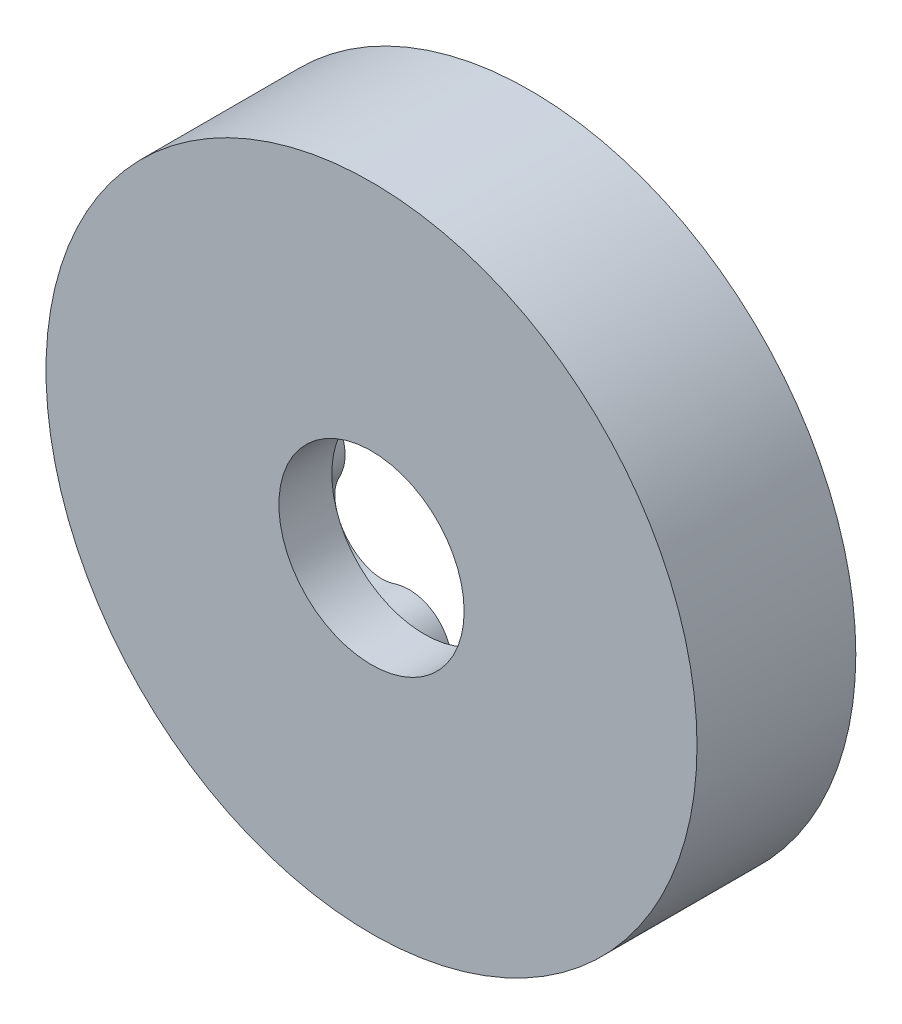
ISO-10303-21;
HEADER;
FILE_DESCRIPTION(('STEP AP214'),'2;1');
FILE_NAME('part.step','',(''),(''),'','','');
FILE_SCHEMA(('AUTOMOTIVE_DESIGN { 1 0 10303 214 1 1 1 1 }'));
ENDSEC;
DATA;
#1=APPLICATION_CONTEXT('core data for automotive mechanical design processes');
#2=APPLICATION_PROTOCOL_DEFINITION('international standard','automotive_design',2000,#1);
#3=PRODUCT_CONTEXT('',#1,'mechanical');
#4=PRODUCT('Part','Part','',(#3));
#5=PRODUCT_RELATED_PRODUCT_CATEGORY('part','',(#4));
#6=PRODUCT_DEFINITION_FORMATION('','',#4);
#7=PRODUCT_DEFINITION_CONTEXT('part definition',#1,'design');
#8=PRODUCT_DEFINITION('design','',#6,#7);
#9=PRODUCT_DEFINITION_SHAPE('','',#8);
#10=(LENGTH_UNIT() NAMED_UNIT(*) SI_UNIT(.MILLI.,.METRE.));
#11=(NAMED_UNIT(*) PLANE_ANGLE_UNIT() SI_UNIT($,.RADIAN.));
#12=(NAMED_UNIT(*) SI_UNIT($,.STERADIAN.) SOLID_ANGLE_UNIT());
#13=UNCERTAINTY_MEASURE_WITH_UNIT(LENGTH_MEASURE(1.E-05),#10,'distance_accuracy_value','');
#14=(GEOMETRIC_REPRESENTATION_CONTEXT(3) GLOBAL_UNCERTAINTY_ASSIGNED_CONTEXT((#13)) GLOBAL_UNIT_ASSIGNED_CONTEXT((#10,
#11,#12)) REPRESENTATION_CONTEXT('',''));
#15=CARTESIAN_POINT('',(0.,0.,0.));
#16=DIRECTION('',(0.,0.,1.));
#17=DIRECTION('',(1.,0.,0.));
#18=AXIS2_PLACEMENT_3D('',#15,#16,#17);
#19=CARTESIAN_POINT('',(0.,0.,0.));
#20=DIRECTION('',(0.,0.,1.));
#21=DIRECTION('',(1.,0.,0.));
#22=AXIS2_PLACEMENT_3D('',#19,#20,#21);
#23=PLANE('',#22);
#24=CARTESIAN_POINT('',(0.,0.,0.));
#25=DIRECTION('',(0.,0.,1.));
#26=DIRECTION('',(1.,0.,0.));
#27=AXIS2_PLACEMENT_3D('',#24,#25,#26);
#28=CIRCLE('',#27,12.3);
#29=CARTESIAN_POINT('',(12.3,0.,0.));
#30=VERTEX_POINT('',#29);
#31=EDGE_CURVE('E11',#30,#30,#28,.T.);
#32=ORIENTED_EDGE('',*,*,#31,.F.);
#33=EDGE_LOOP('',(#32));
#34=FACE_BOUND('',#33,.T.);
#35=CARTESIAN_POINT('',(7.55,0.,0.));
#36=CARTESIAN_POINT('',(7.55000000000027,0.022217466458351,0.));
#37=CARTESIAN_POINT('',(7.55109737708752,0.0666034399524704,0.));
#38=CARTESIAN_POINT('',(7.55603575821352,0.154882157827372,0.));
#39=CARTESIAN_POINT('',(7.56916783899283,0.254768484743971,0.));
#40=CARTESIAN_POINT('',(7.5927854806825,0.374358830288833,0.));
#41=CARTESIAN_POINT('',(7.63179107421422,0.51344008940082,0.));
#42=CARTESIAN_POINT('',(7.69959982716544,0.68617471523545,0.));
#43=CARTESIAN_POINT('',(7.80974701267501,0.886363911281186,0.));
#44=CARTESIAN_POINT('',(7.93834343482286,1.0561194537287,0.));
#45=CARTESIAN_POINT('',(8.0743672383786,1.19947756069296,0.));
#46=CARTESIAN_POINT('',(8.21390626106425,1.33110870091685,0.));
#47=CARTESIAN_POINT('',(8.36346331358419,1.4895036418915,0.));
#48=CARTESIAN_POINT('',(8.52117396998865,1.76029674905826,0.));
#49=CARTESIAN_POINT('',(8.62280091236655,2.12120006036529,0.));
#50=CARTESIAN_POINT('',(8.63998002290779,2.52542727921024,0.));
#51=CARTESIAN_POINT('',(8.57256056481981,2.92522878253747,0.));
#52=CARTESIAN_POINT('',(8.44322684602201,3.27872194255863,0.));
#53=CARTESIAN_POINT('',(8.23679143101039,3.62630702820879,0.));
#54=CARTESIAN_POINT('',(7.95931515564681,3.92599456017719,0.));
#55=CARTESIAN_POINT('',(7.64414612926547,4.13703738101209,0.));
#56=CARTESIAN_POINT('',(7.34433080737036,4.24098140231914,0.));
#57=CARTESIAN_POINT('',(7.11847736507926,4.26175080299851,0.));
#58=CARTESIAN_POINT('',(6.92340982369371,4.27404257216713,0.));
#59=CARTESIAN_POINT('',(6.72949429617699,4.29943333370208,0.));
#60=CARTESIAN_POINT('',(6.4790393779537,4.36132384923424,0.));
#61=CARTESIAN_POINT('',(6.18558438422689,4.49278647484299,0.));
#62=CARTESIAN_POINT('',(5.90099531096105,4.70134332074444,0.));
#63=CARTESIAN_POINT('',(5.65461647568606,4.99496626596589,0.));
#64=CARTESIAN_POINT('',(5.49864635662569,5.31144723524449,0.));
#65=CARTESIAN_POINT('',(5.4201390013435,5.62327233002649,0.));
#66=CARTESIAN_POINT('',(5.40267956639356,5.88066929892235,0.));
#67=CARTESIAN_POINT('',(5.41134800574686,6.07604813655972,0.));
#68=CARTESIAN_POINT('',(5.43311542020648,6.27028613950339,0.));
#69=CARTESIAN_POINT('',(5.45188177508213,6.49631574319122,0.));
#70=CARTESIAN_POINT('',(5.40157719258208,6.8096244453148,0.));
#71=CARTESIAN_POINT('',(5.24847253343536,7.1566549230986,0.));
#72=CARTESIAN_POINT('',(5.0015157096661,7.48195203824925,0.));
#73=CARTESIAN_POINT('',(4.69315520863561,7.74725973604298,0.));
#74=CARTESIAN_POINT('',(4.36274613674722,7.93802150241623,0.));
#75=CARTESIAN_POINT('',(3.97880268030188,8.07241568135727,0.));
#76=CARTESIAN_POINT('',(3.57360870270868,8.12363800618634,0.));
#77=CARTESIAN_POINT('',(3.19651916376383,8.08271529246457,0.));
#78=CARTESIAN_POINT('',(2.90003357687835,7.96962598649736,0.));
#79=CARTESIAN_POINT('',(2.71366937606947,7.84035904656242,0.));
#80=CARTESIAN_POINT('',(2.5563380372269,7.72438890709684,0.));
#81=CARTESIAN_POINT('',(2.39146922258591,7.61919240835861,0.));
#82=CARTESIAN_POINT('',(2.15982718709908,7.50561422338799,0.));
#83=CARTESIAN_POINT('',(1.85052506189385,7.41769106185599,0.));
#84=CARTESIAN_POINT('',(1.49845943392362,7.3945246293179,0.));
#85=CARTESIAN_POINT('',(1.12098510095759,7.4610835387456,0.));
#86=CARTESIAN_POINT('',(0.798075014899017,7.60326640098943,0.));
#87=CARTESIAN_POINT('',(0.537497582558851,7.79167470427317,0.));
#88=CARTESIAN_POINT('',(0.358671298251862,7.97762952874714,0.));
#89=CARTESIAN_POINT('',(0.239724611309845,8.13287035796297,0.));
#90=CARTESIAN_POINT('',(0.131545636907162,8.29565712930166,0.));
#91=CARTESIAN_POINT('',(0.000632469945212832,8.48086862955824,0.));
#92=CARTESIAN_POINT('',(-0.239294027571354,8.68854185875767,0.));
#93=CARTESIAN_POINT('',(-0.579645892302256,8.85596884906921,0.));
#94=CARTESIAN_POINT('',(-0.977922749877955,8.94642011062372,0.));
#95=CARTESIAN_POINT('',(-1.38467709909778,8.95144728852055,0.));
#96=CARTESIAN_POINT('',(-1.76040443237717,8.88519642225764,0.));
#97=CARTESIAN_POINT('',(-2.14090909671924,8.74135423950334,0.));
#98=CARTESIAN_POINT('',(-2.4842307673507,8.52013914851876,0.));
#99=CARTESIAN_POINT('',(-2.74679349992139,8.24640204771912,0.));
#100=CARTESIAN_POINT('',(-2.90122223150353,7.9691933515375,0.));
#101=CARTESIAN_POINT('',(-2.96089430467679,7.75037653148768,0.));
#102=CARTESIAN_POINT('',(-3.00687293361899,7.5604076150508,0.));
#103=CARTESIAN_POINT('',(-3.06555076729845,7.37384679115716,0.));
#104=CARTESIAN_POINT('',(-3.16999221075634,7.13794422226749,0.));
#105=CARTESIAN_POINT('',(-3.3504154670505,6.87177560091305,0.));
#106=CARTESIAN_POINT('',(-3.60522228784321,6.62772565796595,0.));
#107=CARTESIAN_POINT('',(-3.937167647398,6.43607692048254,0.));
#108=CARTESIAN_POINT('',(-4.27592450333094,6.33743270329426,0.));
#109=CARTESIAN_POINT('',(-4.59664492576236,6.31426590279595,0.));
#110=CARTESIAN_POINT('',(-4.85316325468424,6.34176822433256,0.));
#111=CARTESIAN_POINT('',(-5.04406860227897,6.38423217623344,0.));
#112=CARTESIAN_POINT('',(-5.23157579246983,6.43939791211209,0.));
#113=CARTESIAN_POINT('',(-5.45091280943261,6.49712889828531,0.));
#114=CARTESIAN_POINT('',(-5.76819685027559,6.50199385185179,0.));
#115=CARTESIAN_POINT('',(-6.13654166076087,6.41147671768886,0.));
#116=CARTESIAN_POINT('',(-6.49978012509337,6.22475847184648,0.));
#117=CARTESIAN_POINT('',(-6.81460385493834,5.9671536586297,0.));
#118=CARTESIAN_POINT('',(-7.0598417779057,5.67488836434416,0.));
#119=CARTESIAN_POINT('',(-7.25886645404867,5.32011743441555,0.));
#120=CARTESIAN_POINT('',(-7.37966982274836,4.92997010948015,0.));
#121=CARTESIAN_POINT('',(-7.40485279119561,4.55150918979244,0.));
#122=CARTESIAN_POINT('',(-7.34496135370993,4.23988161683878,0.));
#123=CARTESIAN_POINT('',(-7.2500269078284,4.03391498577502,0.));
#124=CARTESIAN_POINT('',(-7.16312462348147,3.85880815844748,0.));
#125=CARTESIAN_POINT('',(-7.08818605319711,3.67823618534094,0.));
#126=CARTESIAN_POINT('',(-7.01650645467254,3.43029150072943,0.));
#127=CARTESIAN_POINT('',(-6.98370366083783,3.11056598882397,0.));
#128=CARTESIAN_POINT('',(-7.02294453567281,2.75014551003197,0.));
#129=CARTESIAN_POINT('',(-7.16387052283851,2.3730552005334,0.));
#130=CARTESIAN_POINT('',(-7.38880714459428,2.05246447300879,0.));
#131=CARTESIAN_POINT('',(-7.67491557585959,1.80488701473581,0.));
#132=CARTESIAN_POINT('',(-7.96175769623171,1.64361375907074,0.));
#133=CARTESIAN_POINT('',(-8.2237943420282,1.54385861169451,0.));
#134=CARTESIAN_POINT('',(-8.43427689913021,1.40817021880368,0.));
#135=CARTESIAN_POINT('',(-8.59255305961644,1.25815337939858,0.));
#136=CARTESIAN_POINT('',(-8.72205328204517,1.09550990603106,0.));
#137=CARTESIAN_POINT('',(-8.82464560083173,0.928393679769974,0.));
#138=CARTESIAN_POINT('',(-8.90628150530056,0.753480861621166,0.));
#139=CARTESIAN_POINT('',(-8.96818608965025,0.584253865795442,0.));
#140=CARTESIAN_POINT('',(-9.01161834121622,0.402056601444345,0.));
#141=CARTESIAN_POINT('',(-9.03849618641081,0.253381349157321,0.));
#142=CARTESIAN_POINT('',(-9.0480108330892,0.0999754638618866,0.));
#143=CARTESIAN_POINT('',(-9.05000000000006,0.0338845457528887,0.));
#144=CARTESIAN_POINT('',(-9.05,0.,0.));
#145=B_SPLINE_CURVE_WITH_KNOTS('',4,(#35,#36,#37,#38,#39,#40,#41,#42,#43,#44,#45,#46,#47,#48,
#49,#50,#51,#52,#53,#54,#55,#56,#57,#58,#59,#60,#61,#62,#63,#64,#65,#66,#67,#68,#69,#70,#71,#72,
#73,#74,#75,#76,#77,#78,#79,#80,#81,#82,#83,#84,#85,#86,#87,#88,#89,#90,#91,#92,#93,#94,#95,#96,
#97,#98,#99,#100,#101,#102,#103,#104,#105,#106,#107,#108,#109,#110,#111,#112,#113,#114,#115,
#116,#117,#118,#119,#120,#121,#122,#123,#124,#125,#126,#127,#128,#129,#130,#131,#132,#133,#134,
#135,#136,#137,#138,#139,#140,#141,#142,#143,#144),.UNSPECIFIED.,.F.,.F.,(5,1,1,1,1,1,1,1,1,1,1,
1,1,1,1,1,1,1,1,1,1,1,1,1,1,1,1,1,1,1,1,1,1,1,1,1,1,1,1,1,1,1,1,1,1,1,1,1,1,1,1,1,1,1,1,1,1,1,1,
1,1,1,1,1,1,1,1,1,1,1,1,1,1,1,1,1,1,1,1,1,1,1,1,1,1,1,1,1,1,1,1,1,1,1,1,1,1,1,1,1,1,1,1,1,1,1,
5),(0.0652033425962136,0.0680905921617996,0.0709778417273857,0.0738650912929718,
0.0767523408585578,0.0819918633429553,0.0872313858273528,0.094866256534403,0.102501127241453,
0.106027866458659,0.109554605675866,0.116608084110278,0.127054156159038,0.141092788851966,
0.151537705238868,0.161982621625769,0.17271143961739,0.183440257609011,0.197050089852305,
0.207783490278052,0.215195934457575,0.218902156547336,0.222608378637098,0.229945232724129,
0.237282086811161,0.248011644951303,0.258761919977337,0.269512195003371,0.280241753143513,
0.287578607230545,0.294915461317577,0.298621683407339,0.3023279054971,0.309740349676624,
0.320473750102371,0.334083582345666,0.344812400337288,0.35554121832891,0.36627003632053,
0.376998854312151,0.390608686555446,0.401342086981192,0.408754531160715,0.412460753250477,
0.416166975340238,0.42350382942727,0.430840683514301,0.441570241654443,0.452320516680474,
0.463070791706508,0.473800349846651,0.481137203933684,0.488474058020716,0.492180280110478,
0.49588650220024,0.503298946379764,0.514032346805512,0.527642179048808,0.538370997040429,
0.54909981503205,0.559828633023671,0.570557451015293,0.584167283258587,0.594900683684334,
0.602313127863857,0.606019349953619,0.609725572043381,0.617062426130412,0.624399280217444,
0.635128838357586,0.645879113383619,0.656629388409653,0.667358946549796,0.674695800636828,
0.682032654723861,0.685738876813622,0.689445098903384,0.696857543082908,0.707590943508655,
0.721200775751951,0.731929593743576,0.7426584117352,0.753387229726826,0.764116047718453,
0.777725879961754,0.788459280387506,0.795871724567033,0.799577946656796,0.80328416874656,
0.810621022833594,0.817957876920628,0.828687435060777,0.839437710086819,0.851255102937441,
0.863061333933954,0.872486064706041,0.881910795478128,0.888312531518343,0.894714267558559,
0.900613035206941,0.906511802855323,0.911736381375932,0.916960959896541,0.92218553841715,
0.927410116937759,0.931813550613258,0.936216984288758),.UNSPECIFIED.);
#146=CARTESIAN_POINT('',(7.55,-1.3359856241198E-11,0.));
#147=VERTEX_POINT('',#146);
#148=CARTESIAN_POINT('',(-9.05,4.34208598569843E-12,0.));
#149=VERTEX_POINT('',#148);
#150=EDGE_CURVE('E55',#147,#149,#145,.T.);
#151=ORIENTED_EDGE('',*,*,#150,.T.);
#152=CARTESIAN_POINT('',(-9.05,4.34208598569843E-12,0.));
#153=CARTESIAN_POINT('',(-9.05000000000009,-0.0338845457485466,0.));
#154=CARTESIAN_POINT('',(-9.0480108330893,-0.0999754638575466,0.));
#155=CARTESIAN_POINT('',(-9.03849618641108,-0.253381349152992,0.));
#156=CARTESIAN_POINT('',(-9.01161834121665,-0.402056601440044,0.));
#157=CARTESIAN_POINT('',(-8.96818608965087,-0.584253865791187,0.));
#158=CARTESIAN_POINT('',(-8.90628150530137,-0.753480861616977,0.));
#159=CARTESIAN_POINT('',(-8.82464560083271,-0.928393679765872,0.));
#160=CARTESIAN_POINT('',(-8.72205328204634,-1.09550990602707,0.));
#161=CARTESIAN_POINT('',(-8.59255305961778,-1.25815337939472,0.));
#162=CARTESIAN_POINT('',(-8.43427689913171,-1.40817021879999,0.));
#163=CARTESIAN_POINT('',(-8.22379434202984,-1.54385861169105,0.));
#164=CARTESIAN_POINT('',(-7.96175769623347,-1.64361375906756,0.));
#165=CARTESIAN_POINT('',(-7.67491557586151,-1.80488701473293,0.));
#166=CARTESIAN_POINT('',(-7.38880714459647,-2.05246447300622,0.));
#167=CARTESIAN_POINT('',(-7.16387052284104,-2.37305520053106,0.));
#168=CARTESIAN_POINT('',(-7.02294453567574,-2.75014551002979,0.));
#169=CARTESIAN_POINT('',(-6.98370366084114,-3.11056598882183,0.));
#170=CARTESIAN_POINT('',(-7.01650645467619,-3.43029150072726,0.));
#171=CARTESIAN_POINT('',(-7.08818605320103,-3.67823618533869,0.));
#172=CARTESIAN_POINT('',(-7.16312462348558,-3.85880815844515,0.));
#173=CARTESIAN_POINT('',(-7.2500269078327,-4.0339149857726,0.));
#174=CARTESIAN_POINT('',(-7.34496135371445,-4.23988161683626,0.));
#175=CARTESIAN_POINT('',(-7.40485279120046,-4.55150918978985,0.));
#176=CARTESIAN_POINT('',(-7.37966982275361,-4.92997010947759,0.));
#177=CARTESIAN_POINT('',(-7.25886645405434,-5.32011743441312,0.));
#178=CARTESIAN_POINT('',(-7.05984177791175,-5.67488836434194,0.));
#179=CARTESIAN_POINT('',(-6.8146038549447,-5.96715365862774,0.));
#180=CARTESIAN_POINT('',(-6.49978012510001,-6.22475847184485,0.));
#181=CARTESIAN_POINT('',(-6.1365416607677,-6.41147671768762,0.));
#182=CARTESIAN_POINT('',(-5.76819685028252,-6.50199385185095,0.));
#183=CARTESIAN_POINT('',(-5.45091280943954,-6.4971288982848,0.));
#184=CARTESIAN_POINT('',(-5.2315757924767,-6.43939791211182,0.));
#185=CARTESIAN_POINT('',(-5.04406860228578,-6.38423217623337,0.));
#186=CARTESIAN_POINT('',(-4.853163254691,-6.34176822433269,0.));
#187=CARTESIAN_POINT('',(-4.59664492576909,-6.31426590279636,0.));
#188=CARTESIAN_POINT('',(-4.27592450333769,-6.33743270329501,0.));
#189=CARTESIAN_POINT('',(-3.93716764740486,-6.43607692048365,0.));
#190=CARTESIAN_POINT('',(-3.60522228785027,-6.62772565796741,0.));
#191=CARTESIAN_POINT('',(-3.35041546705783,-6.87177560091479,0.));
#192=CARTESIAN_POINT('',(-3.16999221076395,-7.13794422226942,0.));
#193=CARTESIAN_POINT('',(-3.06555076730631,-7.3738467911592,0.));
#194=CARTESIAN_POINT('',(-3.00687293362705,-7.5604076150529,0.));
#195=CARTESIAN_POINT('',(-2.96089430468505,-7.75037653148983,0.));
#196=CARTESIAN_POINT('',(-2.90122223151202,-7.96919335153971,0.));
#197=CARTESIAN_POINT('',(-2.74679349993018,-8.2464020477215,0.));
#198=CARTESIAN_POINT('',(-2.48423076735979,-8.52013914852142,0.));
#199=CARTESIAN_POINT('',(-2.14090909672855,-8.74135423950637,0.));
#200=CARTESIAN_POINT('',(-1.76040443238665,-8.88519642226108,0.));
#201=CARTESIAN_POINT('',(-1.38467709910732,-8.95144728852439,0.));
#202=CARTESIAN_POINT('',(-0.977922749887494,-8.94642011062799,0.));
#203=CARTESIAN_POINT('',(-0.579645892311698,-8.8559688490739,0.));
#204=CARTESIAN_POINT('',(-0.239294027580617,-8.68854185876272,0.));
#205=CARTESIAN_POINT('',(0.000632469936170721,-8.48086862956355,0.));
#206=CARTESIAN_POINT('',(0.131545636898317,-8.29565712930711,0.));
#207=CARTESIAN_POINT('',(0.239724611301174,-8.13287035796854,0.));
#208=CARTESIAN_POINT('',(0.358671298243356,-7.97762952875283,0.));
#209=CARTESIAN_POINT('',(0.537497582550544,-7.79167470427905,0.));
#210=CARTESIAN_POINT('',(0.79807501489091,-7.60326640099559,0.));
#211=CARTESIAN_POINT('',(1.12098510094963,-7.4610835387521,0.));
#212=CARTESIAN_POINT('',(1.49845943391574,-7.3945246293248,0.));
#213=CARTESIAN_POINT('',(1.85052506188594,-7.41769106186328,0.));
#214=CARTESIAN_POINT('',(2.15982718709108,-7.5056142233956,0.));
#215=CARTESIAN_POINT('',(2.39146922257779,-7.61919240836647,0.));
#216=CARTESIAN_POINT('',(2.55633803721866,-7.72438890710487,0.));
#217=CARTESIAN_POINT('',(2.71366937606111,-7.84035904657062,0.));
#218=CARTESIAN_POINT('',(2.90003357686985,-7.96962598650576,0.));
#219=CARTESIAN_POINT('',(3.19651916375521,-8.08271529247329,0.));
#220=CARTESIAN_POINT('',(3.57360870270002,-8.12363800619546,0.));
#221=CARTESIAN_POINT('',(3.97880268029327,-8.07241568136682,0.));
#222=CARTESIAN_POINT('',(4.36274613673875,-7.93802150242619,0.));
#223=CARTESIAN_POINT('',(4.69315520862735,-7.7472597360533,0.));
#224=CARTESIAN_POINT('',(5.00151570965813,-7.48195203825989,0.));
#225=CARTESIAN_POINT('',(5.24847253342773,-7.15665492310951,0.));
#226=CARTESIAN_POINT('',(5.40157719257482,-6.80962444532587,0.));
#227=CARTESIAN_POINT('',(5.4518817750752,-6.49631574320234,0.));
#228=CARTESIAN_POINT('',(5.4331154201998,-6.27028613951449,0.));
#229=CARTESIAN_POINT('',(5.41134800574038,-6.0760481365708,0.));
#230=CARTESIAN_POINT('',(5.40267956638729,-5.88066929893342,0.));
#231=CARTESIAN_POINT('',(5.4201390013375,-5.62327233003758,0.));
#232=CARTESIAN_POINT('',(5.49864635662003,-5.31144723525566,0.));
#233=CARTESIAN_POINT('',(5.65461647568074,-4.99496626597723,0.));
#234=CARTESIAN_POINT('',(5.90099531095603,-4.70134332075604,0.));
#235=CARTESIAN_POINT('',(6.1855843842221,-4.4927864748549,0.));
#236=CARTESIAN_POINT('',(6.47903937794905,-4.36132384924646,0.));
#237=CARTESIAN_POINT('',(6.7294942961724,-4.29943333371457,0.));
#238=CARTESIAN_POINT('',(6.92340982368915,-4.27404257217982,0.));
#239=CARTESIAN_POINT('',(7.11847736507471,-4.26175080301141,0.));
#240=CARTESIAN_POINT('',(7.34433080736584,-4.24098140233228,0.));
#241=CARTESIAN_POINT('',(7.64414612926106,-4.13703738102555,0.));
#242=CARTESIAN_POINT('',(7.95931515564262,-3.92599456019099,0.));
#243=CARTESIAN_POINT('',(8.23679143100652,-3.62630702822289,0.));
#244=CARTESIAN_POINT('',(8.44322684601852,-3.27872194257295,0.));
#245=CARTESIAN_POINT('',(8.57256056481669,-2.92522878255192,0.));
#246=CARTESIAN_POINT('',(8.63998002290509,-2.52542727922476,0.));
#247=CARTESIAN_POINT('',(8.62280091236429,-2.1212000603798,0.));
#248=CARTESIAN_POINT('',(8.52117396998677,-1.76029674907265,0.));
#249=CARTESIAN_POINT('',(8.3634633135826,-1.48950364190572,0.));
#250=CARTESIAN_POINT('',(8.21390626106284,-1.33110870093092,0.));
#251=CARTESIAN_POINT('',(8.07436723837733,-1.19947756070688,0.));
#252=CARTESIAN_POINT('',(7.93834343482174,-1.05611945374247,0.));
#253=CARTESIAN_POINT('',(7.80974701267406,-0.886363911294823,0.));
#254=CARTESIAN_POINT('',(7.69959982716471,-0.686174715248969,0.));
#255=CARTESIAN_POINT('',(7.63179107421368,-0.513440089414267,0.));
#256=CARTESIAN_POINT('',(7.59278548068211,-0.374358830302239,0.));
#257=CARTESIAN_POINT('',(7.56916783899256,-0.254768484757351,0.));
#258=CARTESIAN_POINT('',(7.55603575821335,-0.154882157840738,0.));
#259=CARTESIAN_POINT('',(7.55109737708745,-0.0666034399658314,0.));
#260=CARTESIAN_POINT('',(7.55000000000025,-0.0222174664717109,0.));
#261=CARTESIAN_POINT('',(7.55,-1.3359856241198E-11,0.));
#262=B_SPLINE_CURVE_WITH_KNOTS('',4,(#152,#153,#154,#155,#156,#157,#158,#159,#160,#161,#162,
#163,#164,#165,#166,#167,#168,#169,#170,#171,#172,#173,#174,#175,#176,#177,#178,#179,#180,#181,
#182,#183,#184,#185,#186,#187,#188,#189,#190,#191,#192,#193,#194,#195,#196,#197,#198,#199,#200,
#201,#202,#203,#204,#205,#206,#207,#208,#209,#210,#211,#212,#213,#214,#215,#216,#217,#218,#219,
#220,#221,#222,#223,#224,#225,#226,#227,#228,#229,#230,#231,#232,#233,#234,#235,#236,#237,#238,
#239,#240,#241,#242,#243,#244,#245,#246,#247,#248,#249,#250,#251,#252,#253,#254,#255,#256,#257,
#258,#259,#260,#261),.UNSPECIFIED.,.F.,.F.,(5,1,1,1,1,1,1,1,1,1,1,1,1,1,1,1,1,1,1,1,1,1,1,1,1,1,
1,1,1,1,1,1,1,1,1,1,1,1,1,1,1,1,1,1,1,1,1,1,1,1,1,1,1,1,1,1,1,1,1,1,1,1,1,1,1,1,1,1,1,1,1,1,1,1,
1,1,1,1,1,1,1,1,1,1,1,1,1,1,1,1,1,1,1,1,1,1,1,1,1,1,1,1,1,1,1,1,5),(0.0652033425962136,
0.0696067762717131,0.0740102099472127,0.0792347884678217,0.0844593669884307,0.0896839455090396,
0.0949085240296486,0.100807291678031,0.106706059326413,0.113107795366628,0.119509531406844,
0.128934262178931,0.138358992951017,0.150165223947531,0.161982616798153,0.172732891824195,
0.183462449964343,0.190799304051377,0.198136158138412,0.201842380228175,0.205548602317939,
0.212961046497466,0.223694446923218,0.237304279166519,0.248033097158145,0.258761915149772,
0.269490733141396,0.28021955113302,0.293829383376316,0.304562783802064,0.311975227981587,
0.315681450071349,0.319387672161111,0.326724526248143,0.334061380335175,0.344790938475318,
0.355541213501353,0.366291488527385,0.377021046667528,0.384357900754559,0.391694754841591,
0.395400976931353,0.399107199021114,0.406519643200637,0.417253043626384,0.430862875869679,
0.4415916938613,0.452320511852922,0.463049329844543,0.473778147836164,0.48738798007946,
0.498121380505208,0.505533824684732,0.509240046774494,0.512946268864256,0.520283122951288,
0.52761997703832,0.538349535178464,0.549099810204498,0.559850085230529,0.57057964337067,
0.577916497457702,0.585253351544733,0.588959573634495,0.592665795724256,0.600078239903779,
0.610811640329526,0.62442147257282,0.635150290564441,0.645879108556062,0.656607926547684,
0.667336744539306,0.680946576782601,0.691679977208348,0.699092421387871,0.702798643477633,
0.706504865567395,0.713841719654426,0.721178573741458,0.731908131881601,0.742658406907635,
0.753408681933668,0.764138240073811,0.771475094160842,0.778811948247874,0.782518170337635,
0.786224392427397,0.79363683660692,0.804370237032666,0.817980069275961,0.828708887267582,
0.839437705259203,0.849882621646104,0.860327538033005,0.874366170725934,0.884812242774694,
0.891865721209106,0.895392460426312,0.898919199643518,0.906554070350569,0.914188941057619,
0.919428463542016,0.924667986026414,0.927555235592,0.930442485157586,0.933329734723172,
0.936216984288758),.UNSPECIFIED.);
#263=EDGE_CURVE('E65',#149,#147,#262,.T.);
#264=ORIENTED_EDGE('',*,*,#263,.T.);
#265=EDGE_LOOP('',(#151,#264));
#266=FACE_BOUND('',#265,.T.);
#267=ADVANCED_FACE('F33',(#34,#266),#23,.F.);
#268=CARTESIAN_POINT('',(0.,0.,4.));
#269=DIRECTION('',(0.,0.,-1.));
#270=DIRECTION('',(-1.,0.,0.));
#271=AXIS2_PLACEMENT_3D('',#268,#269,#270);
#272=CYLINDRICAL_SURFACE('',#271,12.3);
#273=ORIENTED_EDGE('',*,*,#31,.T.);
#274=EDGE_LOOP('',(#273));
#275=FACE_BOUND('',#274,.T.);
#276=CARTESIAN_POINT('',(0.,0.,6.));
#277=DIRECTION('',(0.,0.,1.));
#278=DIRECTION('',(1.,0.,0.));
#279=AXIS2_PLACEMENT_3D('',#276,#277,#278);
#280=CIRCLE('',#279,12.3);
#281=CARTESIAN_POINT('',(12.3,0.,6.));
#282=VERTEX_POINT('',#281);
#283=EDGE_CURVE('E83',#282,#282,#280,.T.);
#284=ORIENTED_EDGE('',*,*,#283,.F.);
#285=EDGE_LOOP('',(#284));
#286=FACE_BOUND('',#285,.T.);
#287=ADVANCED_FACE('F35',(#275,#286),#272,.T.);
#288=CARTESIAN_POINT('',(7.55,0.,4.));
#289=CARTESIAN_POINT('',(7.55000000000027,0.022217466458351,4.));
#290=CARTESIAN_POINT('',(7.55109737708752,0.0666034399524704,4.));
#291=CARTESIAN_POINT('',(7.55603575821352,0.154882157827372,4.));
#292=CARTESIAN_POINT('',(7.56916783899283,0.254768484743971,4.));
#293=CARTESIAN_POINT('',(7.5927854806825,0.374358830288833,4.));
#294=CARTESIAN_POINT('',(7.63179107421422,0.51344008940082,4.));
#295=CARTESIAN_POINT('',(7.69959982716544,0.68617471523545,4.));
#296=CARTESIAN_POINT('',(7.80974701267501,0.886363911281186,4.));
#297=CARTESIAN_POINT('',(7.93834343482286,1.0561194537287,4.));
#298=CARTESIAN_POINT('',(8.0743672383786,1.19947756069296,4.));
#299=CARTESIAN_POINT('',(8.21390626106425,1.33110870091685,4.));
#300=CARTESIAN_POINT('',(8.36346331358419,1.4895036418915,4.));
#301=CARTESIAN_POINT('',(8.52117396998865,1.76029674905826,4.));
#302=CARTESIAN_POINT('',(8.62280091236655,2.12120006036529,4.));
#303=CARTESIAN_POINT('',(8.63998002290779,2.52542727921024,4.));
#304=CARTESIAN_POINT('',(8.57256056481981,2.92522878253747,4.));
#305=CARTESIAN_POINT('',(8.44322684602201,3.27872194255863,4.));
#306=CARTESIAN_POINT('',(8.23679143101039,3.62630702820879,4.));
#307=CARTESIAN_POINT('',(7.95931515564681,3.92599456017719,4.));
#308=CARTESIAN_POINT('',(7.64414612926547,4.13703738101209,4.));
#309=CARTESIAN_POINT('',(7.34433080737036,4.24098140231914,4.));
#310=CARTESIAN_POINT('',(7.11847736507926,4.26175080299851,4.));
#311=CARTESIAN_POINT('',(6.92340982369371,4.27404257216713,4.));
#312=CARTESIAN_POINT('',(6.72949429617699,4.29943333370208,4.));
#313=CARTESIAN_POINT('',(6.4790393779537,4.36132384923424,4.));
#314=CARTESIAN_POINT('',(6.18558438422689,4.49278647484299,4.));
#315=CARTESIAN_POINT('',(5.90099531096105,4.70134332074444,4.));
#316=CARTESIAN_POINT('',(5.65461647568606,4.99496626596589,4.));
#317=CARTESIAN_POINT('',(5.49864635662569,5.31144723524449,4.));
#318=CARTESIAN_POINT('',(5.4201390013435,5.62327233002649,4.));
#319=CARTESIAN_POINT('',(5.40267956639356,5.88066929892235,4.));
#320=CARTESIAN_POINT('',(5.41134800574686,6.07604813655972,4.));
#321=CARTESIAN_POINT('',(5.43311542020648,6.27028613950339,4.));
#322=CARTESIAN_POINT('',(5.45188177508213,6.49631574319122,4.));
#323=CARTESIAN_POINT('',(5.40157719258208,6.8096244453148,4.));
#324=CARTESIAN_POINT('',(5.24847253343536,7.1566549230986,4.));
#325=CARTESIAN_POINT('',(5.0015157096661,7.48195203824925,4.));
#326=CARTESIAN_POINT('',(4.69315520863561,7.74725973604298,4.));
#327=CARTESIAN_POINT('',(4.36274613674722,7.93802150241623,4.));
#328=CARTESIAN_POINT('',(3.97880268030188,8.07241568135727,4.));
#329=CARTESIAN_POINT('',(3.57360870270868,8.12363800618634,4.));
#330=CARTESIAN_POINT('',(3.19651916376383,8.08271529246457,4.));
#331=CARTESIAN_POINT('',(2.90003357687835,7.96962598649736,4.));
#332=CARTESIAN_POINT('',(2.71366937606947,7.84035904656242,4.));
#333=CARTESIAN_POINT('',(2.5563380372269,7.72438890709684,4.));
#334=CARTESIAN_POINT('',(2.39146922258591,7.61919240835861,4.));
#335=CARTESIAN_POINT('',(2.15982718709908,7.50561422338799,4.));
#336=CARTESIAN_POINT('',(1.85052506189385,7.41769106185599,4.));
#337=CARTESIAN_POINT('',(1.49845943392362,7.3945246293179,4.));
#338=CARTESIAN_POINT('',(1.12098510095759,7.4610835387456,4.));
#339=CARTESIAN_POINT('',(0.798075014899017,7.60326640098943,4.));
#340=CARTESIAN_POINT('',(0.537497582558851,7.79167470427317,4.));
#341=CARTESIAN_POINT('',(0.358671298251862,7.97762952874714,4.));
#342=CARTESIAN_POINT('',(0.239724611309845,8.13287035796297,4.));
#343=CARTESIAN_POINT('',(0.131545636907162,8.29565712930166,4.));
#344=CARTESIAN_POINT('',(0.000632469945212832,8.48086862955824,4.));
#345=CARTESIAN_POINT('',(-0.239294027571354,8.68854185875767,4.));
#346=CARTESIAN_POINT('',(-0.579645892302256,8.85596884906921,4.));
#347=CARTESIAN_POINT('',(-0.977922749877955,8.94642011062372,4.));
#348=CARTESIAN_POINT('',(-1.38467709909778,8.95144728852055,4.));
#349=CARTESIAN_POINT('',(-1.76040443237717,8.88519642225764,4.));
#350=CARTESIAN_POINT('',(-2.14090909671924,8.74135423950334,4.));
#351=CARTESIAN_POINT('',(-2.4842307673507,8.52013914851876,4.));
#352=CARTESIAN_POINT('',(-2.74679349992139,8.24640204771912,4.));
#353=CARTESIAN_POINT('',(-2.90122223150353,7.9691933515375,4.));
#354=CARTESIAN_POINT('',(-2.96089430467679,7.75037653148768,4.));
#355=CARTESIAN_POINT('',(-3.00687293361899,7.5604076150508,4.));
#356=CARTESIAN_POINT('',(-3.06555076729845,7.37384679115716,4.));
#357=CARTESIAN_POINT('',(-3.16999221075634,7.13794422226749,4.));
#358=CARTESIAN_POINT('',(-3.3504154670505,6.87177560091305,4.));
#359=CARTESIAN_POINT('',(-3.60522228784321,6.62772565796595,4.));
#360=CARTESIAN_POINT('',(-3.937167647398,6.43607692048254,4.));
#361=CARTESIAN_POINT('',(-4.27592450333094,6.33743270329426,4.));
#362=CARTESIAN_POINT('',(-4.59664492576236,6.31426590279595,4.));
#363=CARTESIAN_POINT('',(-4.85316325468424,6.34176822433256,4.));
#364=CARTESIAN_POINT('',(-5.04406860227897,6.38423217623344,4.));
#365=CARTESIAN_POINT('',(-5.23157579246983,6.43939791211209,4.));
#366=CARTESIAN_POINT('',(-5.45091280943261,6.49712889828531,4.));
#367=CARTESIAN_POINT('',(-5.76819685027559,6.50199385185179,4.));
#368=CARTESIAN_POINT('',(-6.13654166076087,6.41147671768886,4.));
#369=CARTESIAN_POINT('',(-6.49978012509337,6.22475847184648,4.));
#370=CARTESIAN_POINT('',(-6.81460385493834,5.9671536586297,4.));
#371=CARTESIAN_POINT('',(-7.0598417779057,5.67488836434416,4.));
#372=CARTESIAN_POINT('',(-7.25886645404867,5.32011743441555,4.));
#373=CARTESIAN_POINT('',(-7.37966982274836,4.92997010948015,4.));
#374=CARTESIAN_POINT('',(-7.40485279119561,4.55150918979244,4.));
#375=CARTESIAN_POINT('',(-7.34496135370993,4.23988161683878,4.));
#376=CARTESIAN_POINT('',(-7.2500269078284,4.03391498577502,4.));
#377=CARTESIAN_POINT('',(-7.16312462348147,3.85880815844748,4.));
#378=CARTESIAN_POINT('',(-7.08818605319711,3.67823618534094,4.));
#379=CARTESIAN_POINT('',(-7.01650645467254,3.43029150072943,4.));
#380=CARTESIAN_POINT('',(-6.98370366083783,3.11056598882397,4.));
#381=CARTESIAN_POINT('',(-7.02294453567281,2.75014551003197,4.));
#382=CARTESIAN_POINT('',(-7.16387052283851,2.3730552005334,4.));
#383=CARTESIAN_POINT('',(-7.38880714459428,2.05246447300879,4.));
#384=CARTESIAN_POINT('',(-7.67491557585959,1.80488701473581,4.));
#385=CARTESIAN_POINT('',(-7.96175769623171,1.64361375907074,4.));
#386=CARTESIAN_POINT('',(-8.2237943420282,1.54385861169451,4.));
#387=CARTESIAN_POINT('',(-8.43427689913021,1.40817021880368,4.));
#388=CARTESIAN_POINT('',(-8.59255305961644,1.25815337939858,4.));
#389=CARTESIAN_POINT('',(-8.72205328204517,1.09550990603106,4.));
#390=CARTESIAN_POINT('',(-8.82464560083173,0.928393679769974,4.));
#391=CARTESIAN_POINT('',(-8.90628150530056,0.753480861621166,4.));
#392=CARTESIAN_POINT('',(-8.96818608965025,0.584253865795442,4.));
#393=CARTESIAN_POINT('',(-9.01161834121622,0.402056601444345,4.));
#394=CARTESIAN_POINT('',(-9.03849618641081,0.253381349157321,4.));
#395=CARTESIAN_POINT('',(-9.0480108330892,0.0999754638618866,4.));
#396=CARTESIAN_POINT('',(-9.05000000000006,0.0338845457528887,4.));
#397=CARTESIAN_POINT('',(-9.05,0.,4.));
#398=B_SPLINE_CURVE_WITH_KNOTS('',4,(#288,#289,#290,#291,#292,#293,#294,#295,#296,#297,#298,
#299,#300,#301,#302,#303,#304,#305,#306,#307,#308,#309,#310,#311,#312,#313,#314,#315,#316,#317,
#318,#319,#320,#321,#322,#323,#324,#325,#326,#327,#328,#329,#330,#331,#332,#333,#334,#335,#336,
#337,#338,#339,#340,#341,#342,#343,#344,#345,#346,#347,#348,#349,#350,#351,#352,#353,#354,#355,
#356,#357,#358,#359,#360,#361,#362,#363,#364,#365,#366,#367,#368,#369,#370,#371,#372,#373,#374,
#375,#376,#377,#378,#379,#380,#381,#382,#383,#384,#385,#386,#387,#388,#389,#390,#391,#392,#393,
#394,#395,#396,#397),.UNSPECIFIED.,.F.,.F.,(5,1,1,1,1,1,1,1,1,1,1,1,1,1,1,1,1,1,1,1,1,1,1,1,1,1,
1,1,1,1,1,1,1,1,1,1,1,1,1,1,1,1,1,1,1,1,1,1,1,1,1,1,1,1,1,1,1,1,1,1,1,1,1,1,1,1,1,1,1,1,1,1,1,1,
1,1,1,1,1,1,1,1,1,1,1,1,1,1,1,1,1,1,1,1,1,1,1,1,1,1,1,1,1,1,1,1,5),(0.0652033425962136,
0.0680905921617996,0.0709778417273857,0.0738650912929718,0.0767523408585578,0.0819918633429553,
0.0872313858273528,0.094866256534403,0.102501127241453,0.106027866458659,0.109554605675866,
0.116608084110278,0.127054156159038,0.141092788851966,0.151537705238868,0.161982621625769,
0.17271143961739,0.183440257609011,0.197050089852305,0.207783490278052,0.215195934457575,
0.218902156547336,0.222608378637098,0.229945232724129,0.237282086811161,0.248011644951303,
0.258761919977337,0.269512195003371,0.280241753143513,0.287578607230545,0.294915461317577,
0.298621683407339,0.3023279054971,0.309740349676624,0.320473750102371,0.334083582345666,
0.344812400337288,0.35554121832891,0.36627003632053,0.376998854312151,0.390608686555446,
0.401342086981192,0.408754531160715,0.412460753250477,0.416166975340238,0.42350382942727,
0.430840683514301,0.441570241654443,0.452320516680474,0.463070791706508,0.473800349846651,
0.481137203933684,0.488474058020716,0.492180280110478,0.49588650220024,0.503298946379764,
0.514032346805512,0.527642179048808,0.538370997040429,0.54909981503205,0.559828633023671,
0.570557451015293,0.584167283258587,0.594900683684334,0.602313127863857,0.606019349953619,
0.609725572043381,0.617062426130412,0.624399280217444,0.635128838357586,0.645879113383619,
0.656629388409653,0.667358946549796,0.674695800636828,0.682032654723861,0.685738876813622,
0.689445098903384,0.696857543082908,0.707590943508655,0.721200775751951,0.731929593743576,
0.7426584117352,0.753387229726826,0.764116047718453,0.777725879961754,0.788459280387506,
0.795871724567033,0.799577946656796,0.80328416874656,0.810621022833594,0.817957876920628,
0.828687435060777,0.839437710086819,0.851255102937441,0.863061333933954,0.872486064706041,
0.881910795478128,0.888312531518343,0.894714267558559,0.900613035206941,0.906511802855323,
0.911736381375932,0.916960959896541,0.92218553841715,0.927410116937759,0.931813550613258,
0.936216984288758),.UNSPECIFIED.);
#399=DIRECTION('',(0.,0.,-1.));
#400=VECTOR('',#399,1.);
#401=SURFACE_OF_LINEAR_EXTRUSION('',#398,#400);
#402=ORIENTED_EDGE('',*,*,#150,.F.);
#403=DIRECTION('',(0.,0.,-1.));
#404=VECTOR('',#403,1.);
#405=CARTESIAN_POINT('',(7.55,-1.3359856241198E-11,4.));
#406=LINE('',#405,#404);
#407=CARTESIAN_POINT('',(7.55,-1.3359856241198E-11,4.));
#408=VERTEX_POINT('',#407);
#409=EDGE_CURVE('E69',#408,#147,#406,.T.);
#410=ORIENTED_EDGE('',*,*,#409,.F.);
#411=CARTESIAN_POINT('',(-9.05,4.34208598569843E-12,4.));
#412=VERTEX_POINT('',#411);
#413=EDGE_CURVE('E62',#408,#412,#398,.T.);
#414=ORIENTED_EDGE('',*,*,#413,.T.);
#415=DIRECTION('',(0.,0.,-1.));
#416=VECTOR('',#415,1.);
#417=CARTESIAN_POINT('',(-9.05,4.34208598569843E-12,4.));
#418=LINE('',#417,#416);
#419=EDGE_CURVE('E41',#412,#149,#418,.T.);
#420=ORIENTED_EDGE('',*,*,#419,.T.);
#421=EDGE_LOOP('',(#402,#410,#414,#420));
#422=FACE_BOUND('',#421,.T.);
#423=ADVANCED_FACE('F72',(#422),#401,.T.);
#424=CARTESIAN_POINT('',(-9.05,4.34208598569843E-12,4.));
#425=CARTESIAN_POINT('',(-9.05000000000009,-0.0338845457485466,4.));
#426=CARTESIAN_POINT('',(-9.0480108330893,-0.0999754638575466,4.));
#427=CARTESIAN_POINT('',(-9.03849618641108,-0.253381349152992,4.));
#428=CARTESIAN_POINT('',(-9.01161834121665,-0.402056601440044,4.));
#429=CARTESIAN_POINT('',(-8.96818608965087,-0.584253865791187,4.));
#430=CARTESIAN_POINT('',(-8.90628150530137,-0.753480861616977,4.));
#431=CARTESIAN_POINT('',(-8.82464560083271,-0.928393679765872,4.));
#432=CARTESIAN_POINT('',(-8.72205328204634,-1.09550990602707,4.));
#433=CARTESIAN_POINT('',(-8.59255305961778,-1.25815337939472,4.));
#434=CARTESIAN_POINT('',(-8.43427689913171,-1.40817021879999,4.));
#435=CARTESIAN_POINT('',(-8.22379434202984,-1.54385861169105,4.));
#436=CARTESIAN_POINT('',(-7.96175769623347,-1.64361375906756,4.));
#437=CARTESIAN_POINT('',(-7.67491557586151,-1.80488701473293,4.));
#438=CARTESIAN_POINT('',(-7.38880714459647,-2.05246447300622,4.));
#439=CARTESIAN_POINT('',(-7.16387052284104,-2.37305520053106,4.));
#440=CARTESIAN_POINT('',(-7.02294453567574,-2.75014551002979,4.));
#441=CARTESIAN_POINT('',(-6.98370366084114,-3.11056598882183,4.));
#442=CARTESIAN_POINT('',(-7.01650645467619,-3.43029150072726,4.));
#443=CARTESIAN_POINT('',(-7.08818605320103,-3.67823618533869,4.));
#444=CARTESIAN_POINT('',(-7.16312462348558,-3.85880815844515,4.));
#445=CARTESIAN_POINT('',(-7.2500269078327,-4.0339149857726,4.));
#446=CARTESIAN_POINT('',(-7.34496135371445,-4.23988161683626,4.));
#447=CARTESIAN_POINT('',(-7.40485279120046,-4.55150918978985,4.));
#448=CARTESIAN_POINT('',(-7.37966982275361,-4.92997010947759,4.));
#449=CARTESIAN_POINT('',(-7.25886645405434,-5.32011743441312,4.));
#450=CARTESIAN_POINT('',(-7.05984177791175,-5.67488836434194,4.));
#451=CARTESIAN_POINT('',(-6.8146038549447,-5.96715365862774,4.));
#452=CARTESIAN_POINT('',(-6.49978012510001,-6.22475847184485,4.));
#453=CARTESIAN_POINT('',(-6.1365416607677,-6.41147671768762,4.));
#454=CARTESIAN_POINT('',(-5.76819685028252,-6.50199385185095,4.));
#455=CARTESIAN_POINT('',(-5.45091280943954,-6.4971288982848,4.));
#456=CARTESIAN_POINT('',(-5.2315757924767,-6.43939791211182,4.));
#457=CARTESIAN_POINT('',(-5.04406860228578,-6.38423217623337,4.));
#458=CARTESIAN_POINT('',(-4.853163254691,-6.34176822433269,4.));
#459=CARTESIAN_POINT('',(-4.59664492576909,-6.31426590279636,4.));
#460=CARTESIAN_POINT('',(-4.27592450333769,-6.33743270329501,4.));
#461=CARTESIAN_POINT('',(-3.93716764740486,-6.43607692048365,4.));
#462=CARTESIAN_POINT('',(-3.60522228785027,-6.62772565796741,4.));
#463=CARTESIAN_POINT('',(-3.35041546705783,-6.87177560091479,4.));
#464=CARTESIAN_POINT('',(-3.16999221076395,-7.13794422226942,4.));
#465=CARTESIAN_POINT('',(-3.06555076730631,-7.3738467911592,4.));
#466=CARTESIAN_POINT('',(-3.00687293362705,-7.5604076150529,4.));
#467=CARTESIAN_POINT('',(-2.96089430468505,-7.75037653148983,4.));
#468=CARTESIAN_POINT('',(-2.90122223151202,-7.96919335153971,4.));
#469=CARTESIAN_POINT('',(-2.74679349993018,-8.2464020477215,4.));
#470=CARTESIAN_POINT('',(-2.48423076735979,-8.52013914852142,4.));
#471=CARTESIAN_POINT('',(-2.14090909672855,-8.74135423950637,4.));
#472=CARTESIAN_POINT('',(-1.76040443238665,-8.88519642226108,4.));
#473=CARTESIAN_POINT('',(-1.38467709910732,-8.95144728852439,4.));
#474=CARTESIAN_POINT('',(-0.977922749887494,-8.94642011062799,4.));
#475=CARTESIAN_POINT('',(-0.579645892311698,-8.8559688490739,4.));
#476=CARTESIAN_POINT('',(-0.239294027580617,-8.68854185876272,4.));
#477=CARTESIAN_POINT('',(0.000632469936170721,-8.48086862956355,4.));
#478=CARTESIAN_POINT('',(0.131545636898317,-8.29565712930711,4.));
#479=CARTESIAN_POINT('',(0.239724611301174,-8.13287035796854,4.));
#480=CARTESIAN_POINT('',(0.358671298243356,-7.97762952875283,4.));
#481=CARTESIAN_POINT('',(0.537497582550544,-7.79167470427905,4.));
#482=CARTESIAN_POINT('',(0.79807501489091,-7.60326640099559,4.));
#483=CARTESIAN_POINT('',(1.12098510094963,-7.4610835387521,4.));
#484=CARTESIAN_POINT('',(1.49845943391574,-7.3945246293248,4.));
#485=CARTESIAN_POINT('',(1.85052506188594,-7.41769106186328,4.));
#486=CARTESIAN_POINT('',(2.15982718709108,-7.5056142233956,4.));
#487=CARTESIAN_POINT('',(2.39146922257779,-7.61919240836647,4.));
#488=CARTESIAN_POINT('',(2.55633803721866,-7.72438890710487,4.));
#489=CARTESIAN_POINT('',(2.71366937606111,-7.84035904657062,4.));
#490=CARTESIAN_POINT('',(2.90003357686985,-7.96962598650576,4.));
#491=CARTESIAN_POINT('',(3.19651916375521,-8.08271529247329,4.));
#492=CARTESIAN_POINT('',(3.57360870270002,-8.12363800619546,4.));
#493=CARTESIAN_POINT('',(3.97880268029327,-8.07241568136682,4.));
#494=CARTESIAN_POINT('',(4.36274613673875,-7.93802150242619,4.));
#495=CARTESIAN_POINT('',(4.69315520862735,-7.7472597360533,4.));
#496=CARTESIAN_POINT('',(5.00151570965813,-7.48195203825989,4.));
#497=CARTESIAN_POINT('',(5.24847253342773,-7.15665492310951,4.));
#498=CARTESIAN_POINT('',(5.40157719257482,-6.80962444532587,4.));
#499=CARTESIAN_POINT('',(5.4518817750752,-6.49631574320234,4.));
#500=CARTESIAN_POINT('',(5.4331154201998,-6.27028613951449,4.));
#501=CARTESIAN_POINT('',(5.41134800574038,-6.0760481365708,4.));
#502=CARTESIAN_POINT('',(5.40267956638729,-5.88066929893342,4.));
#503=CARTESIAN_POINT('',(5.4201390013375,-5.62327233003758,4.));
#504=CARTESIAN_POINT('',(5.49864635662003,-5.31144723525566,4.));
#505=CARTESIAN_POINT('',(5.65461647568074,-4.99496626597723,4.));
#506=CARTESIAN_POINT('',(5.90099531095603,-4.70134332075604,4.));
#507=CARTESIAN_POINT('',(6.1855843842221,-4.4927864748549,4.));
#508=CARTESIAN_POINT('',(6.47903937794905,-4.36132384924646,4.));
#509=CARTESIAN_POINT('',(6.7294942961724,-4.29943333371457,4.));
#510=CARTESIAN_POINT('',(6.92340982368915,-4.27404257217982,4.));
#511=CARTESIAN_POINT('',(7.11847736507471,-4.26175080301141,4.));
#512=CARTESIAN_POINT('',(7.34433080736584,-4.24098140233228,4.));
#513=CARTESIAN_POINT('',(7.64414612926106,-4.13703738102555,4.));
#514=CARTESIAN_POINT('',(7.95931515564262,-3.92599456019099,4.));
#515=CARTESIAN_POINT('',(8.23679143100652,-3.62630702822289,4.));
#516=CARTESIAN_POINT('',(8.44322684601852,-3.27872194257295,4.));
#517=CARTESIAN_POINT('',(8.57256056481669,-2.92522878255192,4.));
#518=CARTESIAN_POINT('',(8.63998002290509,-2.52542727922476,4.));
#519=CARTESIAN_POINT('',(8.62280091236429,-2.1212000603798,4.));
#520=CARTESIAN_POINT('',(8.52117396998677,-1.76029674907265,4.));
#521=CARTESIAN_POINT('',(8.3634633135826,-1.48950364190572,4.));
#522=CARTESIAN_POINT('',(8.21390626106284,-1.33110870093092,4.));
#523=CARTESIAN_POINT('',(8.07436723837733,-1.19947756070688,4.));
#524=CARTESIAN_POINT('',(7.93834343482174,-1.05611945374247,4.));
#525=CARTESIAN_POINT('',(7.80974701267406,-0.886363911294823,4.));
#526=CARTESIAN_POINT('',(7.69959982716471,-0.686174715248969,4.));
#527=CARTESIAN_POINT('',(7.63179107421368,-0.513440089414267,4.));
#528=CARTESIAN_POINT('',(7.59278548068211,-0.374358830302239,4.));
#529=CARTESIAN_POINT('',(7.56916783899256,-0.254768484757351,4.));
#530=CARTESIAN_POINT('',(7.55603575821335,-0.154882157840738,4.));
#531=CARTESIAN_POINT('',(7.55109737708745,-0.0666034399658314,4.));
#532=CARTESIAN_POINT('',(7.55000000000025,-0.0222174664717109,4.));
#533=CARTESIAN_POINT('',(7.55,-1.3359856241198E-11,4.));
#534=B_SPLINE_CURVE_WITH_KNOTS('',4,(#424,#425,#426,#427,#428,#429,#430,#431,#432,#433,#434,
#435,#436,#437,#438,#439,#440,#441,#442,#443,#444,#445,#446,#447,#448,#449,#450,#451,#452,#453,
#454,#455,#456,#457,#458,#459,#460,#461,#462,#463,#464,#465,#466,#467,#468,#469,#470,#471,#472,
#473,#474,#475,#476,#477,#478,#479,#480,#481,#482,#483,#484,#485,#486,#487,#488,#489,#490,#491,
#492,#493,#494,#495,#496,#497,#498,#499,#500,#501,#502,#503,#504,#505,#506,#507,#508,#509,#510,
#511,#512,#513,#514,#515,#516,#517,#518,#519,#520,#521,#522,#523,#524,#525,#526,#527,#528,#529,
#530,#531,#532,#533),.UNSPECIFIED.,.F.,.F.,(5,1,1,1,1,1,1,1,1,1,1,1,1,1,1,1,1,1,1,1,1,1,1,1,1,1,
1,1,1,1,1,1,1,1,1,1,1,1,1,1,1,1,1,1,1,1,1,1,1,1,1,1,1,1,1,1,1,1,1,1,1,1,1,1,1,1,1,1,1,1,1,1,1,1,
1,1,1,1,1,1,1,1,1,1,1,1,1,1,1,1,1,1,1,1,1,1,1,1,1,1,1,1,1,1,1,1,5),(0.0652033425962136,
0.0696067762717131,0.0740102099472127,0.0792347884678217,0.0844593669884307,0.0896839455090396,
0.0949085240296486,0.100807291678031,0.106706059326413,0.113107795366628,0.119509531406844,
0.128934262178931,0.138358992951017,0.150165223947531,0.161982616798153,0.172732891824195,
0.183462449964343,0.190799304051377,0.198136158138412,0.201842380228175,0.205548602317939,
0.212961046497466,0.223694446923218,0.237304279166519,0.248033097158145,0.258761915149772,
0.269490733141396,0.28021955113302,0.293829383376316,0.304562783802064,0.311975227981587,
0.315681450071349,0.319387672161111,0.326724526248143,0.334061380335175,0.344790938475318,
0.355541213501353,0.366291488527385,0.377021046667528,0.384357900754559,0.391694754841591,
0.395400976931353,0.399107199021114,0.406519643200637,0.417253043626384,0.430862875869679,
0.4415916938613,0.452320511852922,0.463049329844543,0.473778147836164,0.48738798007946,
0.498121380505208,0.505533824684732,0.509240046774494,0.512946268864256,0.520283122951288,
0.52761997703832,0.538349535178464,0.549099810204498,0.559850085230529,0.57057964337067,
0.577916497457702,0.585253351544733,0.588959573634495,0.592665795724256,0.600078239903779,
0.610811640329526,0.62442147257282,0.635150290564441,0.645879108556062,0.656607926547684,
0.667336744539306,0.680946576782601,0.691679977208348,0.699092421387871,0.702798643477633,
0.706504865567395,0.713841719654426,0.721178573741458,0.731908131881601,0.742658406907635,
0.753408681933668,0.764138240073811,0.771475094160842,0.778811948247874,0.782518170337635,
0.786224392427397,0.79363683660692,0.804370237032666,0.817980069275961,0.828708887267582,
0.839437705259203,0.849882621646104,0.860327538033005,0.874366170725934,0.884812242774694,
0.891865721209106,0.895392460426312,0.898919199643518,0.906554070350569,0.914188941057619,
0.919428463542016,0.924667986026414,0.927555235592,0.930442485157586,0.933329734723172,
0.936216984288758),.UNSPECIFIED.);
#535=DIRECTION('',(0.,0.,-1.));
#536=VECTOR('',#535,1.);
#537=SURFACE_OF_LINEAR_EXTRUSION('',#534,#536);
#538=ORIENTED_EDGE('',*,*,#263,.F.);
#539=ORIENTED_EDGE('',*,*,#419,.F.);
#540=EDGE_CURVE('E47',#412,#408,#534,.T.);
#541=ORIENTED_EDGE('',*,*,#540,.T.);
#542=ORIENTED_EDGE('',*,*,#409,.T.);
#543=EDGE_LOOP('',(#538,#539,#541,#542));
#544=FACE_BOUND('',#543,.T.);
#545=ADVANCED_FACE('F68',(#544),#537,.T.);
#546=CARTESIAN_POINT('',(0.,0.,6.));
#547=DIRECTION('',(0.,0.,1.));
#548=DIRECTION('',(1.,0.,0.));
#549=AXIS2_PLACEMENT_3D('',#546,#547,#548);
#550=PLANE('',#549);
#551=ORIENTED_EDGE('',*,*,#283,.T.);
#552=EDGE_LOOP('',(#551));
#553=FACE_BOUND('',#552,.T.);
#554=CARTESIAN_POINT('',(0.,0.,6.));
#555=DIRECTION('',(0.,0.,1.));
#556=DIRECTION('',(1.,0.,0.));
#557=AXIS2_PLACEMENT_3D('',#554,#555,#556);
#558=CIRCLE('',#557,3.5);
#559=CARTESIAN_POINT('',(3.5,0.,6.));
#560=VERTEX_POINT('',#559);
#561=EDGE_CURVE('E116',#560,#560,#558,.T.);
#562=ORIENTED_EDGE('',*,*,#561,.F.);
#563=EDGE_LOOP('',(#562));
#564=FACE_BOUND('',#563,.T.);
#565=ADVANCED_FACE('F101',(#553,#564),#550,.T.);
#566=CARTESIAN_POINT('',(0.,0.,4.));
#567=DIRECTION('',(0.,0.,1.));
#568=DIRECTION('',(1.,0.,0.));
#569=AXIS2_PLACEMENT_3D('',#566,#567,#568);
#570=PLANE('',#569);
#571=ORIENTED_EDGE('',*,*,#540,.F.);
#572=ORIENTED_EDGE('',*,*,#413,.F.);
#573=EDGE_LOOP('',(#571,#572));
#574=FACE_BOUND('',#573,.T.);
#575=CARTESIAN_POINT('',(0.,0.,4.));
#576=DIRECTION('',(0.,0.,1.));
#577=DIRECTION('',(1.,0.,0.));
#578=AXIS2_PLACEMENT_3D('',#575,#576,#577);
#579=CIRCLE('',#578,3.5);
#580=CARTESIAN_POINT('',(3.5,0.,4.));
#581=VERTEX_POINT('',#580);
#582=EDGE_CURVE('E118',#581,#581,#579,.T.);
#583=ORIENTED_EDGE('',*,*,#582,.T.);
#584=EDGE_LOOP('',(#583));
#585=FACE_BOUND('',#584,.T.);
#586=ADVANCED_FACE('F63',(#574,#585),#570,.F.);
#587=CARTESIAN_POINT('',(0.,0.,6.));
#588=DIRECTION('',(0.,0.,-1.));
#589=DIRECTION('',(-1.,0.,0.));
#590=AXIS2_PLACEMENT_3D('',#587,#588,#589);
#591=CYLINDRICAL_SURFACE('',#590,3.5);
#592=ORIENTED_EDGE('',*,*,#561,.T.);
#593=EDGE_LOOP('',(#592));
#594=FACE_BOUND('',#593,.T.);
#595=ORIENTED_EDGE('',*,*,#582,.F.);
#596=EDGE_LOOP('',(#595));
#597=FACE_BOUND('',#596,.T.);
#598=ADVANCED_FACE('F124',(#594,#597),#591,.F.);
#599=CLOSED_SHELL('',(#267,#287,#423,#545,#565,#586,#598));
#600=MANIFOLD_SOLID_BREP('B2',#599);
#601=ADVANCED_BREP_SHAPE_REPRESENTATION('',(#18,#600),#14);
#602=SHAPE_DEFINITION_REPRESENTATION(#9,#601);
ENDSEC;
END-ISO-10303-21;
